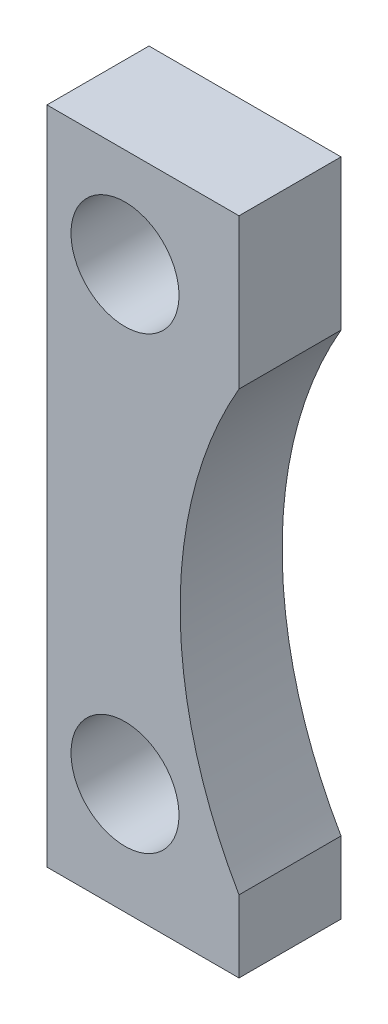
ISO-10303-21;
HEADER;
FILE_DESCRIPTION(('STEP AP214'),'2;1');
FILE_NAME('part.step','',(''),(''),'','','');
FILE_SCHEMA(('AUTOMOTIVE_DESIGN { 1 0 10303 214 1 1 1 1 }'));
ENDSEC;
DATA;
#1=APPLICATION_CONTEXT('core data for automotive mechanical design processes');
#2=APPLICATION_PROTOCOL_DEFINITION('international standard','automotive_design',2000,#1);
#3=PRODUCT_CONTEXT('',#1,'mechanical');
#4=PRODUCT('Part','Part','',(#3));
#5=PRODUCT_RELATED_PRODUCT_CATEGORY('part','',(#4));
#6=PRODUCT_DEFINITION_FORMATION('','',#4);
#7=PRODUCT_DEFINITION_CONTEXT('part definition',#1,'design');
#8=PRODUCT_DEFINITION('design','',#6,#7);
#9=PRODUCT_DEFINITION_SHAPE('','',#8);
#10=(LENGTH_UNIT() NAMED_UNIT(*) SI_UNIT(.MILLI.,.METRE.));
#11=(NAMED_UNIT(*) PLANE_ANGLE_UNIT() SI_UNIT($,.RADIAN.));
#12=(NAMED_UNIT(*) SI_UNIT($,.STERADIAN.) SOLID_ANGLE_UNIT());
#13=UNCERTAINTY_MEASURE_WITH_UNIT(LENGTH_MEASURE(1.E-05),#10,'distance_accuracy_value','');
#14=(GEOMETRIC_REPRESENTATION_CONTEXT(3) GLOBAL_UNCERTAINTY_ASSIGNED_CONTEXT((#13)) GLOBAL_UNIT_ASSIGNED_CONTEXT((#10,
#11,#12)) REPRESENTATION_CONTEXT('',''));
#15=CARTESIAN_POINT('',(0.,0.,0.));
#16=DIRECTION('',(0.,0.,1.));
#17=DIRECTION('',(1.,0.,0.));
#18=AXIS2_PLACEMENT_3D('',#15,#16,#17);
#19=CARTESIAN_POINT('',(0.,110.,8.5));
#20=DIRECTION('',(1.,0.,0.));
#21=DIRECTION('',(0.,1.,0.));
#22=AXIS2_PLACEMENT_3D('',#19,#20,#21);
#23=PLANE('',#22);
#24=DIRECTION('',(0.,-1.,0.));
#25=VECTOR('',#24,1.);
#26=CARTESIAN_POINT('',(0.,110.,-8.5));
#27=LINE('',#26,#25);
#28=CARTESIAN_POINT('',(0.,110.,-8.5));
#29=VERTEX_POINT('',#28);
#30=CARTESIAN_POINT('',(0.,0.,-8.5));
#31=VERTEX_POINT('',#30);
#32=EDGE_CURVE('E122',#29,#31,#27,.T.);
#33=ORIENTED_EDGE('',*,*,#32,.T.);
#34=DIRECTION('',(0.,0.,-1.));
#35=VECTOR('',#34,1.);
#36=CARTESIAN_POINT('',(0.,0.,8.5));
#37=LINE('',#36,#35);
#38=CARTESIAN_POINT('',(0.,0.,8.5));
#39=VERTEX_POINT('',#38);
#40=EDGE_CURVE('E11',#39,#31,#37,.T.);
#41=ORIENTED_EDGE('',*,*,#40,.F.);
#42=DIRECTION('',(0.,-1.,0.));
#43=VECTOR('',#42,1.);
#44=CARTESIAN_POINT('',(0.,110.,8.5));
#45=LINE('',#44,#43);
#46=CARTESIAN_POINT('',(0.,110.,8.5));
#47=VERTEX_POINT('',#46);
#48=EDGE_CURVE('E133',#47,#39,#45,.T.);
#49=ORIENTED_EDGE('',*,*,#48,.F.);
#50=DIRECTION('',(0.,0.,-1.));
#51=VECTOR('',#50,1.);
#52=CARTESIAN_POINT('',(0.,110.,8.5));
#53=LINE('',#52,#51);
#54=EDGE_CURVE('E118',#47,#29,#53,.T.);
#55=ORIENTED_EDGE('',*,*,#54,.T.);
#56=EDGE_LOOP('',(#33,#41,#49,#55));
#57=FACE_BOUND('',#56,.T.);
#58=ADVANCED_FACE('F38',(#57),#23,.F.);
#59=CARTESIAN_POINT('',(0.,0.,8.5));
#60=DIRECTION('',(0.,1.,0.));
#61=DIRECTION('',(0.,0.,1.));
#62=AXIS2_PLACEMENT_3D('',#59,#60,#61);
#63=PLANE('',#62);
#64=DIRECTION('',(1.,0.,0.));
#65=VECTOR('',#64,1.);
#66=CARTESIAN_POINT('',(0.,0.,-8.5));
#67=LINE('',#66,#65);
#68=CARTESIAN_POINT('',(32.,0.,-8.5));
#69=VERTEX_POINT('',#68);
#70=EDGE_CURVE('E125',#31,#69,#67,.T.);
#71=ORIENTED_EDGE('',*,*,#70,.T.);
#72=DIRECTION('',(0.,0.,-1.));
#73=VECTOR('',#72,1.);
#74=CARTESIAN_POINT('',(32.,0.,8.5));
#75=LINE('',#74,#73);
#76=CARTESIAN_POINT('',(32.,0.,8.5));
#77=VERTEX_POINT('',#76);
#78=EDGE_CURVE('E46',#77,#69,#75,.T.);
#79=ORIENTED_EDGE('',*,*,#78,.F.);
#80=DIRECTION('',(1.,0.,0.));
#81=VECTOR('',#80,1.);
#82=CARTESIAN_POINT('',(0.,0.,8.5));
#83=LINE('',#82,#81);
#84=EDGE_CURVE('E91',#39,#77,#83,.T.);
#85=ORIENTED_EDGE('',*,*,#84,.F.);
#86=ORIENTED_EDGE('',*,*,#40,.T.);
#87=EDGE_LOOP('',(#71,#79,#85,#86));
#88=FACE_BOUND('',#87,.T.);
#89=ADVANCED_FACE('F159',(#88),#63,.F.);
#90=CARTESIAN_POINT('',(32.,12.,8.5));
#91=DIRECTION('',(-1.,0.,0.));
#92=DIRECTION('',(0.,-1.,0.));
#93=AXIS2_PLACEMENT_3D('',#90,#91,#92);
#94=PLANE('',#93);
#95=DIRECTION('',(0.,1.,0.));
#96=VECTOR('',#95,1.);
#97=CARTESIAN_POINT('',(32.,12.,-8.5));
#98=LINE('',#97,#96);
#99=CARTESIAN_POINT('',(32.,12.,-8.5));
#100=VERTEX_POINT('',#99);
#101=EDGE_CURVE('E128',#69,#100,#98,.T.);
#102=ORIENTED_EDGE('',*,*,#101,.T.);
#103=DIRECTION('',(0.,0.,-1.));
#104=VECTOR('',#103,1.);
#105=CARTESIAN_POINT('',(32.,12.,8.5));
#106=LINE('',#105,#104);
#107=CARTESIAN_POINT('',(32.,12.,8.5));
#108=VERTEX_POINT('',#107);
#109=EDGE_CURVE('E113',#108,#100,#106,.T.);
#110=ORIENTED_EDGE('',*,*,#109,.F.);
#111=DIRECTION('',(0.,1.,0.));
#112=VECTOR('',#111,1.);
#113=CARTESIAN_POINT('',(32.,12.,8.5));
#114=LINE('',#113,#112);
#115=EDGE_CURVE('E104',#77,#108,#114,.T.);
#116=ORIENTED_EDGE('',*,*,#115,.F.);
#117=ORIENTED_EDGE('',*,*,#78,.T.);
#118=EDGE_LOOP('',(#102,#110,#116,#117));
#119=FACE_BOUND('',#118,.T.);
#120=ADVANCED_FACE('F139',(#119),#94,.F.);
#121=CARTESIAN_POINT('',(95.000000000003,48.5,8.5));
#122=DIRECTION('',(0.,0.,-1.));
#123=DIRECTION('',(-1.,0.,0.));
#124=AXIS2_PLACEMENT_3D('',#121,#122,#123);
#125=CYLINDRICAL_SURFACE('',#124,72.8096834219211);
#126=CARTESIAN_POINT('',(95.000000000003,48.5,-8.5));
#127=DIRECTION('',(0.,0.,-1.));
#128=DIRECTION('',(1.,0.,0.));
#129=AXIS2_PLACEMENT_3D('',#126,#127,#128);
#130=CIRCLE('',#129,72.8096834219211);
#131=CARTESIAN_POINT('',(32.,85.,-8.5));
#132=VERTEX_POINT('',#131);
#133=EDGE_CURVE('E112',#100,#132,#130,.T.);
#134=ORIENTED_EDGE('',*,*,#133,.T.);
#135=DIRECTION('',(0.,0.,-1.));
#136=VECTOR('',#135,1.);
#137=CARTESIAN_POINT('',(32.,85.,8.5));
#138=LINE('',#137,#136);
#139=CARTESIAN_POINT('',(32.,85.,8.5));
#140=VERTEX_POINT('',#139);
#141=EDGE_CURVE('E109',#140,#132,#138,.T.);
#142=ORIENTED_EDGE('',*,*,#141,.F.);
#143=CARTESIAN_POINT('',(95.000000000003,48.5,8.5));
#144=DIRECTION('',(0.,0.,-1.));
#145=DIRECTION('',(1.,0.,0.));
#146=AXIS2_PLACEMENT_3D('',#143,#144,#145);
#147=CIRCLE('',#146,72.8096834219211);
#148=EDGE_CURVE('E98',#108,#140,#147,.T.);
#149=ORIENTED_EDGE('',*,*,#148,.F.);
#150=ORIENTED_EDGE('',*,*,#109,.T.);
#151=EDGE_LOOP('',(#134,#142,#149,#150));
#152=FACE_BOUND('',#151,.T.);
#153=ADVANCED_FACE('F110',(#152),#125,.F.);
#154=CARTESIAN_POINT('',(32.,110.,8.5));
#155=DIRECTION('',(-1.,0.,0.));
#156=DIRECTION('',(0.,-1.,0.));
#157=AXIS2_PLACEMENT_3D('',#154,#155,#156);
#158=PLANE('',#157);
#159=DIRECTION('',(0.,1.,0.));
#160=VECTOR('',#159,1.);
#161=CARTESIAN_POINT('',(32.,110.,-8.5));
#162=LINE('',#161,#160);
#163=CARTESIAN_POINT('',(32.,110.,-8.5));
#164=VERTEX_POINT('',#163);
#165=EDGE_CURVE('E77',#132,#164,#162,.T.);
#166=ORIENTED_EDGE('',*,*,#165,.T.);
#167=DIRECTION('',(0.,0.,-1.));
#168=VECTOR('',#167,1.);
#169=CARTESIAN_POINT('',(32.,110.,8.5));
#170=LINE('',#169,#168);
#171=CARTESIAN_POINT('',(32.,110.,8.5));
#172=VERTEX_POINT('',#171);
#173=EDGE_CURVE('E114',#172,#164,#170,.T.);
#174=ORIENTED_EDGE('',*,*,#173,.F.);
#175=DIRECTION('',(0.,1.,0.));
#176=VECTOR('',#175,1.);
#177=CARTESIAN_POINT('',(32.,110.,8.5));
#178=LINE('',#177,#176);
#179=EDGE_CURVE('E102',#140,#172,#178,.T.);
#180=ORIENTED_EDGE('',*,*,#179,.F.);
#181=ORIENTED_EDGE('',*,*,#141,.T.);
#182=EDGE_LOOP('',(#166,#174,#180,#181));
#183=FACE_BOUND('',#182,.T.);
#184=ADVANCED_FACE('F116',(#183),#158,.F.);
#185=CARTESIAN_POINT('',(0.,110.,8.5));
#186=DIRECTION('',(0.,-1.,0.));
#187=DIRECTION('',(0.,0.,-1.));
#188=AXIS2_PLACEMENT_3D('',#185,#186,#187);
#189=PLANE('',#188);
#190=DIRECTION('',(-1.,0.,0.));
#191=VECTOR('',#190,1.);
#192=CARTESIAN_POINT('',(0.,110.,-8.5));
#193=LINE('',#192,#191);
#194=EDGE_CURVE('E83',#164,#29,#193,.T.);
#195=ORIENTED_EDGE('',*,*,#194,.T.);
#196=ORIENTED_EDGE('',*,*,#54,.F.);
#197=DIRECTION('',(-1.,0.,0.));
#198=VECTOR('',#197,1.);
#199=CARTESIAN_POINT('',(0.,110.,8.5));
#200=LINE('',#199,#198);
#201=EDGE_CURVE('E54',#172,#47,#200,.T.);
#202=ORIENTED_EDGE('',*,*,#201,.F.);
#203=ORIENTED_EDGE('',*,*,#173,.T.);
#204=EDGE_LOOP('',(#195,#196,#202,#203));
#205=FACE_BOUND('',#204,.T.);
#206=ADVANCED_FACE('F146',(#205),#189,.F.);
#207=CARTESIAN_POINT('',(95.000000000003,48.5,8.5));
#208=DIRECTION('',(0.,0.,1.));
#209=DIRECTION('',(1.,0.,0.));
#210=AXIS2_PLACEMENT_3D('',#207,#208,#209);
#211=PLANE('',#210);
#212=CARTESIAN_POINT('',(13.000000000003,93.4999999999999,8.5));
#213=DIRECTION('',(0.,0.,-1.));
#214=DIRECTION('',(-1.,0.,0.));
#215=AXIS2_PLACEMENT_3D('',#212,#213,#214);
#216=CIRCLE('',#215,9.00000000000002);
#217=CARTESIAN_POINT('',(4.000000000003,93.4999999999999,8.5));
#218=VERTEX_POINT('',#217);
#219=EDGE_CURVE('E126',#218,#218,#216,.T.);
#220=ORIENTED_EDGE('',*,*,#219,.T.);
#221=EDGE_LOOP('',(#220));
#222=FACE_BOUND('',#221,.T.);
#223=CARTESIAN_POINT('',(13.000000000003,18.4999999999999,8.5));
#224=DIRECTION('',(0.,0.,-1.));
#225=DIRECTION('',(-1.,0.,0.));
#226=AXIS2_PLACEMENT_3D('',#223,#224,#225);
#227=CIRCLE('',#226,9.);
#228=CARTESIAN_POINT('',(4.00000000000302,18.4999999999999,8.5));
#229=VERTEX_POINT('',#228);
#230=EDGE_CURVE('E220',#229,#229,#227,.T.);
#231=ORIENTED_EDGE('',*,*,#230,.T.);
#232=EDGE_LOOP('',(#231));
#233=FACE_BOUND('',#232,.T.);
#234=ORIENTED_EDGE('',*,*,#48,.T.);
#235=ORIENTED_EDGE('',*,*,#84,.T.);
#236=ORIENTED_EDGE('',*,*,#115,.T.);
#237=ORIENTED_EDGE('',*,*,#148,.T.);
#238=ORIENTED_EDGE('',*,*,#179,.T.);
#239=ORIENTED_EDGE('',*,*,#201,.T.);
#240=EDGE_LOOP('',(#234,#235,#236,#237,#238,#239));
#241=FACE_BOUND('',#240,.T.);
#242=ADVANCED_FACE('F100',(#222,#233,#241),#211,.T.);
#243=CARTESIAN_POINT('',(95.000000000003,48.5,-8.5));
#244=DIRECTION('',(0.,0.,1.));
#245=DIRECTION('',(1.,0.,0.));
#246=AXIS2_PLACEMENT_3D('',#243,#244,#245);
#247=PLANE('',#246);
#248=CARTESIAN_POINT('',(13.000000000003,93.4999999999999,-8.5));
#249=DIRECTION('',(0.,0.,-1.));
#250=DIRECTION('',(-1.,0.,0.));
#251=AXIS2_PLACEMENT_3D('',#248,#249,#250);
#252=CIRCLE('',#251,9.00000000000002);
#253=CARTESIAN_POINT('',(4.000000000003,93.4999999999999,-8.5));
#254=VERTEX_POINT('',#253);
#255=EDGE_CURVE('E219',#254,#254,#252,.T.);
#256=ORIENTED_EDGE('',*,*,#255,.F.);
#257=EDGE_LOOP('',(#256));
#258=FACE_BOUND('',#257,.T.);
#259=CARTESIAN_POINT('',(13.000000000003,18.4999999999999,-8.5));
#260=DIRECTION('',(0.,0.,-1.));
#261=DIRECTION('',(-1.,0.,0.));
#262=AXIS2_PLACEMENT_3D('',#259,#260,#261);
#263=CIRCLE('',#262,9.);
#264=CARTESIAN_POINT('',(4.00000000000302,18.4999999999999,-8.5));
#265=VERTEX_POINT('',#264);
#266=EDGE_CURVE('E224',#265,#265,#263,.T.);
#267=ORIENTED_EDGE('',*,*,#266,.F.);
#268=EDGE_LOOP('',(#267));
#269=FACE_BOUND('',#268,.T.);
#270=ORIENTED_EDGE('',*,*,#32,.F.);
#271=ORIENTED_EDGE('',*,*,#194,.F.);
#272=ORIENTED_EDGE('',*,*,#165,.F.);
#273=ORIENTED_EDGE('',*,*,#133,.F.);
#274=ORIENTED_EDGE('',*,*,#101,.F.);
#275=ORIENTED_EDGE('',*,*,#70,.F.);
#276=EDGE_LOOP('',(#270,#271,#272,#273,#274,#275));
#277=FACE_BOUND('',#276,.T.);
#278=ADVANCED_FACE('F142',(#258,#269,#277),#247,.F.);
#279=CARTESIAN_POINT('',(13.000000000003,18.4999999999999,8.5));
#280=DIRECTION('',(0.,0.,-1.));
#281=DIRECTION('',(-1.,0.,0.));
#282=AXIS2_PLACEMENT_3D('',#279,#280,#281);
#283=CYLINDRICAL_SURFACE('',#282,9.);
#284=ORIENTED_EDGE('',*,*,#230,.F.);
#285=EDGE_LOOP('',(#284));
#286=FACE_BOUND('',#285,.T.);
#287=ORIENTED_EDGE('',*,*,#266,.T.);
#288=EDGE_LOOP('',(#287));
#289=FACE_BOUND('',#288,.T.);
#290=ADVANCED_FACE('F192',(#286,#289),#283,.F.);
#291=CARTESIAN_POINT('',(13.000000000003,93.4999999999999,8.5));
#292=DIRECTION('',(0.,0.,-1.));
#293=DIRECTION('',(-1.,0.,0.));
#294=AXIS2_PLACEMENT_3D('',#291,#292,#293);
#295=CYLINDRICAL_SURFACE('',#294,9.00000000000002);
#296=ORIENTED_EDGE('',*,*,#219,.F.);
#297=EDGE_LOOP('',(#296));
#298=FACE_BOUND('',#297,.T.);
#299=ORIENTED_EDGE('',*,*,#255,.T.);
#300=EDGE_LOOP('',(#299));
#301=FACE_BOUND('',#300,.T.);
#302=ADVANCED_FACE('F200',(#298,#301),#295,.F.);
#303=CLOSED_SHELL('',(#58,#89,#120,#153,#184,#206,#242,#278,#290,#302));
#304=MANIFOLD_SOLID_BREP('B2',#303);
#305=ADVANCED_BREP_SHAPE_REPRESENTATION('',(#18,#304),#14);
#306=SHAPE_DEFINITION_REPRESENTATION(#9,#305);
ENDSEC;
END-ISO-10303-21;
